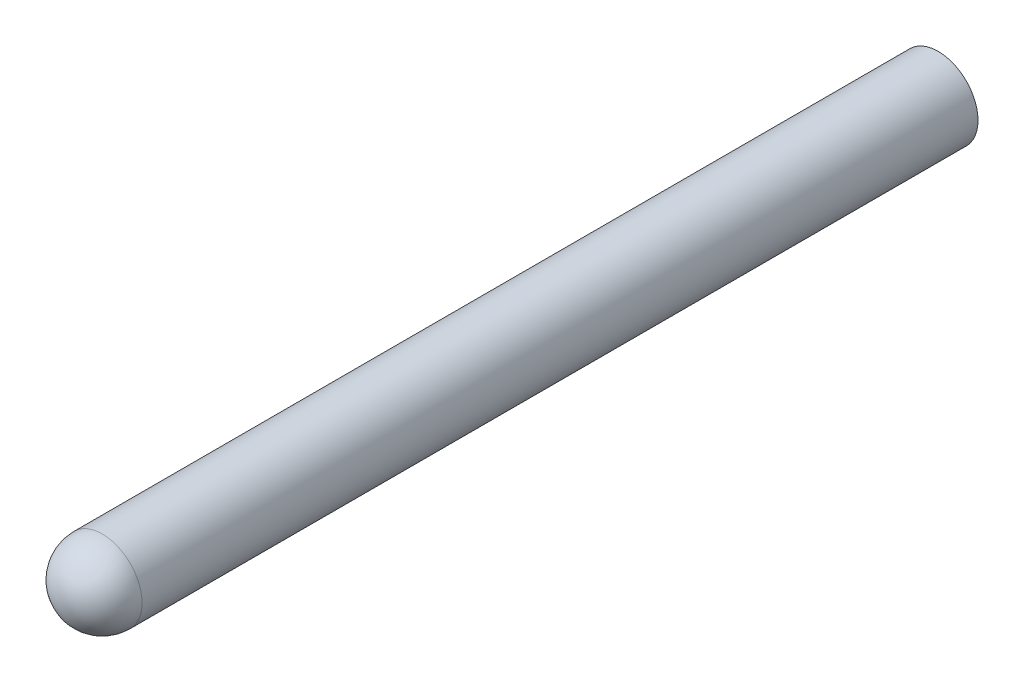
ISO-10303-21;
HEADER;
FILE_DESCRIPTION(('STEP AP214'),'2;1');
FILE_NAME('part.step','',(''),(''),'','','');
FILE_SCHEMA(('AUTOMOTIVE_DESIGN { 1 0 10303 214 1 1 1 1 }'));
ENDSEC;
DATA;
#1=APPLICATION_CONTEXT('core data for automotive mechanical design processes');
#2=APPLICATION_PROTOCOL_DEFINITION('international standard','automotive_design',2000,#1);
#3=PRODUCT_CONTEXT('',#1,'mechanical');
#4=PRODUCT('Part','Part','',(#3));
#5=PRODUCT_RELATED_PRODUCT_CATEGORY('part','',(#4));
#6=PRODUCT_DEFINITION_FORMATION('','',#4);
#7=PRODUCT_DEFINITION_CONTEXT('part definition',#1,'design');
#8=PRODUCT_DEFINITION('design','',#6,#7);
#9=PRODUCT_DEFINITION_SHAPE('','',#8);
#10=(LENGTH_UNIT() NAMED_UNIT(*) SI_UNIT(.MILLI.,.METRE.));
#11=(NAMED_UNIT(*) PLANE_ANGLE_UNIT() SI_UNIT($,.RADIAN.));
#12=(NAMED_UNIT(*) SI_UNIT($,.STERADIAN.) SOLID_ANGLE_UNIT());
#13=UNCERTAINTY_MEASURE_WITH_UNIT(LENGTH_MEASURE(1.E-05),#10,'distance_accuracy_value','');
#14=(GEOMETRIC_REPRESENTATION_CONTEXT(3) GLOBAL_UNCERTAINTY_ASSIGNED_CONTEXT((#13)) GLOBAL_UNIT_ASSIGNED_CONTEXT((#10,
#11,#12)) REPRESENTATION_CONTEXT('',''));
#15=CARTESIAN_POINT('',(0.,0.,0.));
#16=DIRECTION('',(0.,0.,1.));
#17=DIRECTION('',(1.,0.,0.));
#18=AXIS2_PLACEMENT_3D('',#15,#16,#17);
#19=CARTESIAN_POINT('',(0.,0.,0.));
#20=DIRECTION('',(0.,0.,1.));
#21=DIRECTION('',(1.,0.,0.));
#22=AXIS2_PLACEMENT_3D('',#19,#20,#21);
#23=PLANE('',#22);
#24=CARTESIAN_POINT('',(0.,0.,0.));
#25=DIRECTION('',(0.,0.,1.));
#26=DIRECTION('',(1.,0.,0.));
#27=AXIS2_PLACEMENT_3D('',#24,#25,#26);
#28=CIRCLE('',#27,11.43);
#29=CARTESIAN_POINT('',(11.43,0.,0.));
#30=VERTEX_POINT('',#29);
#31=EDGE_CURVE('E48',#30,#30,#28,.T.);
#32=ORIENTED_EDGE('',*,*,#31,.T.);
#33=EDGE_LOOP('',(#32));
#34=FACE_BOUND('',#33,.T.);
#35=CARTESIAN_POINT('',(0.,0.,0.));
#36=DIRECTION('',(0.,0.,1.));
#37=DIRECTION('',(1.,0.,0.));
#38=AXIS2_PLACEMENT_3D('',#35,#36,#37);
#39=CIRCLE('',#38,12.7);
#40=CARTESIAN_POINT('',(12.7,0.,0.));
#41=VERTEX_POINT('',#40);
#42=EDGE_CURVE('E62',#41,#41,#39,.T.);
#43=ORIENTED_EDGE('',*,*,#42,.F.);
#44=EDGE_LOOP('',(#43));
#45=FACE_BOUND('',#44,.T.);
#46=ADVANCED_FACE('F37',(#34,#45),#23,.F.);
#47=CARTESIAN_POINT('',(0.,0.,266.7));
#48=DIRECTION('',(0.,0.,-1.));
#49=DIRECTION('',(-1.,0.,0.));
#50=AXIS2_PLACEMENT_3D('',#47,#48,#49);
#51=CYLINDRICAL_SURFACE('',#50,12.7);
#52=CARTESIAN_POINT('',(0.,0.,266.7));
#53=DIRECTION('',(0.,0.,1.));
#54=DIRECTION('',(1.,0.,0.));
#55=AXIS2_PLACEMENT_3D('',#52,#53,#54);
#56=CIRCLE('',#55,12.7);
#57=CARTESIAN_POINT('',(12.7,0.,266.7));
#58=VERTEX_POINT('',#57);
#59=EDGE_CURVE('E57',#58,#58,#56,.T.);
#60=ORIENTED_EDGE('',*,*,#59,.F.);
#61=EDGE_LOOP('',(#60));
#62=FACE_BOUND('',#61,.T.);
#63=ORIENTED_EDGE('',*,*,#42,.T.);
#64=EDGE_LOOP('',(#63));
#65=FACE_BOUND('',#64,.T.);
#66=ADVANCED_FACE('F88',(#62,#65),#51,.T.);
#67=CARTESIAN_POINT('',(0.,0.,266.7));
#68=DIRECTION('',(0.,0.,1.));
#69=DIRECTION('',(-1.,0.,0.));
#70=AXIS2_PLACEMENT_3D('',#67,#68,#69);
#71=SPHERICAL_SURFACE('',#70,12.7);
#72=ORIENTED_EDGE('',*,*,#59,.T.);
#73=EDGE_LOOP('',(#72));
#74=FACE_BOUND('',#73,.T.);
#75=ADVANCED_FACE('F94',(#74),#71,.T.);
#76=CARTESIAN_POINT('',(0.,0.,12.7));
#77=DIRECTION('',(0.,0.,-1.));
#78=DIRECTION('',(-1.,0.,0.));
#79=AXIS2_PLACEMENT_3D('',#76,#77,#78);
#80=CYLINDRICAL_SURFACE('',#79,10.16);
#81=CARTESIAN_POINT('',(0.,0.,12.065));
#82=DIRECTION('',(0.,0.,-1.));
#83=DIRECTION('',(-1.,0.,0.));
#84=AXIS2_PLACEMENT_3D('',#81,#82,#83);
#85=CIRCLE('',#84,10.16);
#86=CARTESIAN_POINT('',(-10.16,0.,12.065));
#87=VERTEX_POINT('',#86);
#88=EDGE_CURVE('E10',#87,#87,#85,.F.);
#89=ORIENTED_EDGE('',*,*,#88,.T.);
#90=EDGE_LOOP('',(#89));
#91=FACE_BOUND('',#90,.T.);
#92=CARTESIAN_POINT('',(0.,0.,1.27));
#93=DIRECTION('',(0.,0.,1.));
#94=DIRECTION('',(1.,0.,0.));
#95=AXIS2_PLACEMENT_3D('',#92,#93,#94);
#96=CIRCLE('',#95,10.16);
#97=CARTESIAN_POINT('',(10.16,0.,1.27));
#98=VERTEX_POINT('',#97);
#99=EDGE_CURVE('E52',#98,#98,#96,.F.);
#100=ORIENTED_EDGE('',*,*,#99,.T.);
#101=EDGE_LOOP('',(#100));
#102=FACE_BOUND('',#101,.T.);
#103=ADVANCED_FACE('F83',(#91,#102),#80,.F.);
#104=CARTESIAN_POINT('',(0.,0.,12.7));
#105=DIRECTION('',(0.,0.,-1.));
#106=DIRECTION('',(-1.,0.,0.));
#107=AXIS2_PLACEMENT_3D('',#104,#105,#106);
#108=PLANE('',#107);
#109=CARTESIAN_POINT('',(0.,0.,12.7));
#110=DIRECTION('',(0.,0.,-1.));
#111=DIRECTION('',(-1.,0.,0.));
#112=AXIS2_PLACEMENT_3D('',#109,#110,#111);
#113=CIRCLE('',#112,9.525);
#114=CARTESIAN_POINT('',(-9.525,0.,12.7));
#115=VERTEX_POINT('',#114);
#116=EDGE_CURVE('E44',#115,#115,#113,.T.);
#117=ORIENTED_EDGE('',*,*,#116,.T.);
#118=EDGE_LOOP('',(#117));
#119=FACE_BOUND('',#118,.T.);
#120=CARTESIAN_POINT('',(0.,0.,12.7));
#121=DIRECTION('',(0.,0.,-1.));
#122=DIRECTION('',(-1.,0.,0.));
#123=AXIS2_PLACEMENT_3D('',#120,#121,#122);
#124=CIRCLE('',#123,8.89);
#125=CARTESIAN_POINT('',(-8.89,0.,12.7));
#126=VERTEX_POINT('',#125);
#127=EDGE_CURVE('E58',#126,#126,#124,.T.);
#128=ORIENTED_EDGE('',*,*,#127,.F.);
#129=EDGE_LOOP('',(#128));
#130=FACE_BOUND('',#129,.T.);
#131=ADVANCED_FACE('F75',(#119,#130),#108,.T.);
#132=CARTESIAN_POINT('',(-12.7,0.,266.7));
#133=DIRECTION('',(0.,0.,1.));
#134=DIRECTION('',(1.,0.,0.));
#135=AXIS2_PLACEMENT_3D('',#132,#133,#134);
#136=PLANE('',#135);
#137=CARTESIAN_POINT('',(0.,0.,266.7));
#138=DIRECTION('',(0.,0.,1.));
#139=DIRECTION('',(1.,0.,0.));
#140=AXIS2_PLACEMENT_3D('',#137,#138,#139);
#141=CIRCLE('',#140,8.89);
#142=CARTESIAN_POINT('',(8.89,0.,266.7));
#143=VERTEX_POINT('',#142);
#144=EDGE_CURVE('E61',#143,#143,#141,.T.);
#145=ORIENTED_EDGE('',*,*,#144,.F.);
#146=EDGE_LOOP('',(#145));
#147=FACE_BOUND('',#146,.T.);
#148=ADVANCED_FACE('F73',(#147),#136,.F.);
#149=CARTESIAN_POINT('',(0.,0.,266.7));
#150=DIRECTION('',(0.,0.,-1.));
#151=DIRECTION('',(-1.,0.,0.));
#152=AXIS2_PLACEMENT_3D('',#149,#150,#151);
#153=CYLINDRICAL_SURFACE('',#152,8.89);
#154=ORIENTED_EDGE('',*,*,#144,.T.);
#155=EDGE_LOOP('',(#154));
#156=FACE_BOUND('',#155,.T.);
#157=ORIENTED_EDGE('',*,*,#127,.T.);
#158=EDGE_LOOP('',(#157));
#159=FACE_BOUND('',#158,.T.);
#160=ADVANCED_FACE('F70',(#156,#159),#153,.F.);
#161=CARTESIAN_POINT('',(0.,0.,1.27));
#162=DIRECTION('',(0.,0.,-1.));
#163=DIRECTION('',(-1.,0.,0.));
#164=AXIS2_PLACEMENT_3D('',#161,#162,#163);
#165=CONICAL_SURFACE('',#164,10.16,0.785398163397457);
#166=ORIENTED_EDGE('',*,*,#31,.F.);
#167=EDGE_LOOP('',(#166));
#168=FACE_BOUND('',#167,.T.);
#169=ORIENTED_EDGE('',*,*,#99,.F.);
#170=EDGE_LOOP('',(#169));
#171=FACE_BOUND('',#170,.T.);
#172=ADVANCED_FACE('F81',(#168,#171),#165,.F.);
#173=CARTESIAN_POINT('',(0.,0.,12.065));
#174=DIRECTION('',(0.,0.,-1.));
#175=DIRECTION('',(-1.,0.,0.));
#176=AXIS2_PLACEMENT_3D('',#173,#174,#175);
#177=TOROIDAL_SURFACE('',#176,9.525,0.635);
#178=ORIENTED_EDGE('',*,*,#88,.F.);
#179=EDGE_LOOP('',(#178));
#180=FACE_BOUND('',#179,.T.);
#181=ORIENTED_EDGE('',*,*,#116,.F.);
#182=EDGE_LOOP('',(#181));
#183=FACE_BOUND('',#182,.T.);
#184=ADVANCED_FACE('F39',(#180,#183),#177,.F.);
#185=CLOSED_SHELL('',(#46,#66,#75,#103,#131,#148,#160,#172,#184));
#186=MANIFOLD_SOLID_BREP('B2',#185);
#187=ADVANCED_BREP_SHAPE_REPRESENTATION('',(#18,#186),#14);
#188=SHAPE_DEFINITION_REPRESENTATION(#9,#187);
ENDSEC;
END-ISO-10303-21;
